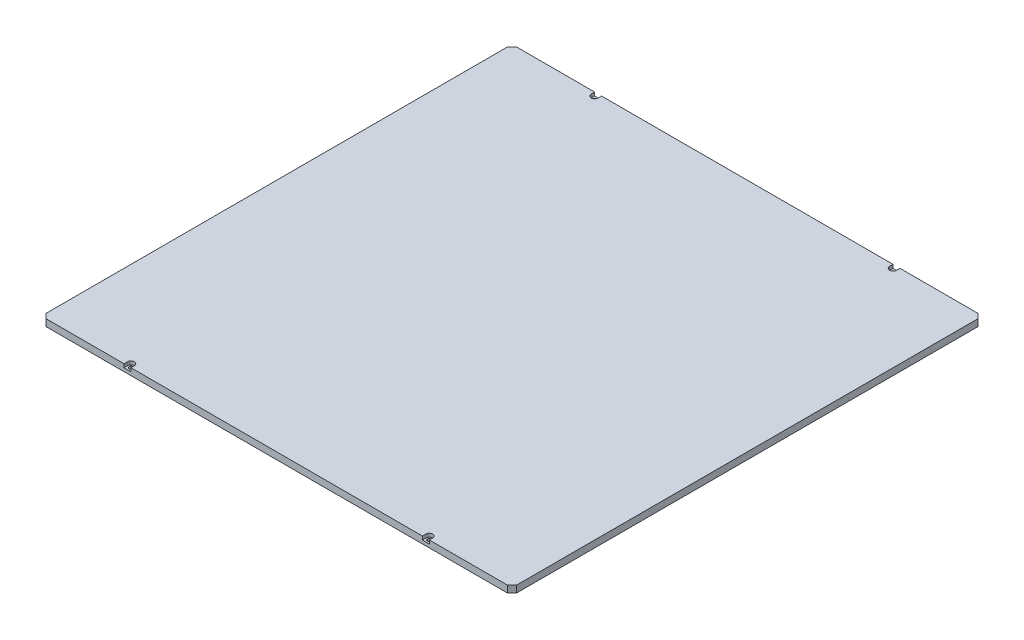
ISO-10303-21;
HEADER;
FILE_DESCRIPTION(('STEP AP214'),'2;1');
FILE_NAME('part.step','',(''),(''),'','','');
FILE_SCHEMA(('AUTOMOTIVE_DESIGN { 1 0 10303 214 1 1 1 1 }'));
ENDSEC;
DATA;
#1=APPLICATION_CONTEXT('core data for automotive mechanical design processes');
#2=APPLICATION_PROTOCOL_DEFINITION('international standard','automotive_design',2000,#1);
#3=PRODUCT_CONTEXT('',#1,'mechanical');
#4=PRODUCT('Part','Part','',(#3));
#5=PRODUCT_RELATED_PRODUCT_CATEGORY('part','',(#4));
#6=PRODUCT_DEFINITION_FORMATION('','',#4);
#7=PRODUCT_DEFINITION_CONTEXT('part definition',#1,'design');
#8=PRODUCT_DEFINITION('design','',#6,#7);
#9=PRODUCT_DEFINITION_SHAPE('','',#8);
#10=(LENGTH_UNIT() NAMED_UNIT(*) SI_UNIT(.MILLI.,.METRE.));
#11=(NAMED_UNIT(*) PLANE_ANGLE_UNIT() SI_UNIT($,.RADIAN.));
#12=(NAMED_UNIT(*) SI_UNIT($,.STERADIAN.) SOLID_ANGLE_UNIT());
#13=UNCERTAINTY_MEASURE_WITH_UNIT(LENGTH_MEASURE(1.E-05),#10,'distance_accuracy_value','');
#14=(GEOMETRIC_REPRESENTATION_CONTEXT(3) GLOBAL_UNCERTAINTY_ASSIGNED_CONTEXT((#13)) GLOBAL_UNIT_ASSIGNED_CONTEXT((#10,
#11,#12)) REPRESENTATION_CONTEXT('',''));
#15=CARTESIAN_POINT('',(0.,0.,0.));
#16=DIRECTION('',(0.,0.,1.));
#17=DIRECTION('',(1.,0.,0.));
#18=AXIS2_PLACEMENT_3D('',#15,#16,#17);
#19=CARTESIAN_POINT('',(-205.,3.,205.));
#20=DIRECTION('',(1.,0.,0.));
#21=DIRECTION('',(0.,0.,-1.));
#22=AXIS2_PLACEMENT_3D('',#19,#20,#21);
#23=PLANE('',#22);
#24=DIRECTION('',(0.,0.,1.));
#25=VECTOR('',#24,1.);
#26=CARTESIAN_POINT('',(-205.,3.,205.));
#27=LINE('',#26,#25);
#28=CARTESIAN_POINT('',(-205.,3.,-201.));
#29=VERTEX_POINT('',#28);
#30=CARTESIAN_POINT('',(-205.,3.,201.));
#31=VERTEX_POINT('',#30);
#32=EDGE_CURVE('E318',#29,#31,#27,.T.);
#33=ORIENTED_EDGE('',*,*,#32,.F.);
#34=DIRECTION('',(0.,-1.,0.));
#35=VECTOR('',#34,1.);
#36=CARTESIAN_POINT('',(-205.,3.,-201.));
#37=LINE('',#36,#35);
#38=CARTESIAN_POINT('',(-205.,-3.,-201.));
#39=VERTEX_POINT('',#38);
#40=EDGE_CURVE('E347',#29,#39,#37,.T.);
#41=ORIENTED_EDGE('',*,*,#40,.T.);
#42=DIRECTION('',(0.,0.,1.));
#43=VECTOR('',#42,1.);
#44=CARTESIAN_POINT('',(-205.,-3.,205.));
#45=LINE('',#44,#43);
#46=CARTESIAN_POINT('',(-205.,-3.,201.));
#47=VERTEX_POINT('',#46);
#48=EDGE_CURVE('E310',#39,#47,#45,.T.);
#49=ORIENTED_EDGE('',*,*,#48,.T.);
#50=DIRECTION('',(0.,1.,0.));
#51=VECTOR('',#50,1.);
#52=CARTESIAN_POINT('',(-205.,3.,201.));
#53=LINE('',#52,#51);
#54=EDGE_CURVE('E334',#47,#31,#53,.T.);
#55=ORIENTED_EDGE('',*,*,#54,.T.);
#56=EDGE_LOOP('',(#33,#41,#49,#55));
#57=FACE_BOUND('',#56,.T.);
#58=ADVANCED_FACE('F35',(#57),#23,.F.);
#59=CARTESIAN_POINT('',(205.,3.,205.));
#60=DIRECTION('',(0.,0.,-1.));
#61=DIRECTION('',(-1.,0.,0.));
#62=AXIS2_PLACEMENT_3D('',#59,#60,#61);
#63=PLANE('',#62);
#64=DIRECTION('',(1.,0.,0.));
#65=VECTOR('',#64,1.);
#66=CARTESIAN_POINT('',(205.,3.,205.));
#67=LINE('',#66,#65);
#68=CARTESIAN_POINT('',(-127.,3.,205.));
#69=VERTEX_POINT('',#68);
#70=CARTESIAN_POINT('',(127.,3.,205.));
#71=VERTEX_POINT('',#70);
#72=EDGE_CURVE('E327',#69,#71,#67,.T.);
#73=ORIENTED_EDGE('',*,*,#72,.F.);
#74=DIRECTION('',(0.,1.,0.));
#75=VECTOR('',#74,1.);
#76=CARTESIAN_POINT('',(-127.,0.,205.));
#77=LINE('',#76,#75);
#78=CARTESIAN_POINT('',(-127.,0.,205.));
#79=VERTEX_POINT('',#78);
#80=EDGE_CURVE('E255',#79,#69,#77,.T.);
#81=ORIENTED_EDGE('',*,*,#80,.F.);
#82=DIRECTION('',(1.,0.,0.));
#83=VECTOR('',#82,1.);
#84=CARTESIAN_POINT('',(-133.,0.,205.));
#85=LINE('',#84,#83);
#86=CARTESIAN_POINT('',(-133.,0.,205.));
#87=VERTEX_POINT('',#86);
#88=EDGE_CURVE('E241',#87,#79,#85,.T.);
#89=ORIENTED_EDGE('',*,*,#88,.F.);
#90=DIRECTION('',(0.,1.,0.));
#91=VECTOR('',#90,1.);
#92=CARTESIAN_POINT('',(-133.,0.,205.));
#93=LINE('',#92,#91);
#94=CARTESIAN_POINT('',(-133.,3.,205.));
#95=VERTEX_POINT('',#94);
#96=EDGE_CURVE('E257',#87,#95,#93,.T.);
#97=ORIENTED_EDGE('',*,*,#96,.T.);
#98=CARTESIAN_POINT('',(-201.,3.,205.));
#99=VERTEX_POINT('',#98);
#100=EDGE_CURVE('E323',#99,#95,#67,.T.);
#101=ORIENTED_EDGE('',*,*,#100,.F.);
#102=DIRECTION('',(0.,-1.,0.));
#103=VECTOR('',#102,1.);
#104=CARTESIAN_POINT('',(-201.,3.,205.));
#105=LINE('',#104,#103);
#106=CARTESIAN_POINT('',(-201.,-3.,205.));
#107=VERTEX_POINT('',#106);
#108=EDGE_CURVE('E43',#99,#107,#105,.T.);
#109=ORIENTED_EDGE('',*,*,#108,.T.);
#110=DIRECTION('',(1.,0.,0.));
#111=VECTOR('',#110,1.);
#112=CARTESIAN_POINT('',(205.,-3.,205.));
#113=LINE('',#112,#111);
#114=CARTESIAN_POINT('',(201.,-3.,205.));
#115=VERTEX_POINT('',#114);
#116=EDGE_CURVE('E338',#107,#115,#113,.T.);
#117=ORIENTED_EDGE('',*,*,#116,.T.);
#118=DIRECTION('',(0.,1.,0.));
#119=VECTOR('',#118,1.);
#120=CARTESIAN_POINT('',(201.,3.,205.));
#121=LINE('',#120,#119);
#122=CARTESIAN_POINT('',(201.,3.,205.));
#123=VERTEX_POINT('',#122);
#124=EDGE_CURVE('E11',#115,#123,#121,.T.);
#125=ORIENTED_EDGE('',*,*,#124,.T.);
#126=CARTESIAN_POINT('',(133.,3.,205.));
#127=VERTEX_POINT('',#126);
#128=EDGE_CURVE('E321',#127,#123,#67,.T.);
#129=ORIENTED_EDGE('',*,*,#128,.F.);
#130=DIRECTION('',(0.,1.,0.));
#131=VECTOR('',#130,1.);
#132=CARTESIAN_POINT('',(133.,0.,205.));
#133=LINE('',#132,#131);
#134=CARTESIAN_POINT('',(133.,0.,205.));
#135=VERTEX_POINT('',#134);
#136=EDGE_CURVE('E311',#135,#127,#133,.T.);
#137=ORIENTED_EDGE('',*,*,#136,.F.);
#138=DIRECTION('',(1.,0.,0.));
#139=VECTOR('',#138,1.);
#140=CARTESIAN_POINT('',(127.,0.,205.));
#141=LINE('',#140,#139);
#142=CARTESIAN_POINT('',(127.,0.,205.));
#143=VERTEX_POINT('',#142);
#144=EDGE_CURVE('E296',#143,#135,#141,.T.);
#145=ORIENTED_EDGE('',*,*,#144,.F.);
#146=DIRECTION('',(0.,1.,0.));
#147=VECTOR('',#146,1.);
#148=CARTESIAN_POINT('',(127.,0.,205.));
#149=LINE('',#148,#147);
#150=EDGE_CURVE('E313',#143,#71,#149,.T.);
#151=ORIENTED_EDGE('',*,*,#150,.T.);
#152=EDGE_LOOP('',(#73,#81,#89,#97,#101,#109,#117,#125,#129,#137,#145,#151));
#153=FACE_BOUND('',#152,.T.);
#154=ADVANCED_FACE('F382',(#153),#63,.F.);
#155=CARTESIAN_POINT('',(205.,3.,205.));
#156=DIRECTION('',(-1.,0.,0.));
#157=DIRECTION('',(0.,0.,1.));
#158=AXIS2_PLACEMENT_3D('',#155,#156,#157);
#159=PLANE('',#158);
#160=DIRECTION('',(0.,0.,-1.));
#161=VECTOR('',#160,1.);
#162=CARTESIAN_POINT('',(205.,-3.,205.));
#163=LINE('',#162,#161);
#164=CARTESIAN_POINT('',(205.,-3.,201.));
#165=VERTEX_POINT('',#164);
#166=CARTESIAN_POINT('',(205.,-3.,-201.));
#167=VERTEX_POINT('',#166);
#168=EDGE_CURVE('E341',#165,#167,#163,.T.);
#169=ORIENTED_EDGE('',*,*,#168,.T.);
#170=DIRECTION('',(0.,1.,0.));
#171=VECTOR('',#170,1.);
#172=CARTESIAN_POINT('',(205.,3.,-201.));
#173=LINE('',#172,#171);
#174=CARTESIAN_POINT('',(205.,3.,-201.));
#175=VERTEX_POINT('',#174);
#176=EDGE_CURVE('E375',#167,#175,#173,.T.);
#177=ORIENTED_EDGE('',*,*,#176,.T.);
#178=DIRECTION('',(0.,0.,-1.));
#179=VECTOR('',#178,1.);
#180=CARTESIAN_POINT('',(205.,3.,205.));
#181=LINE('',#180,#179);
#182=CARTESIAN_POINT('',(205.,3.,201.));
#183=VERTEX_POINT('',#182);
#184=EDGE_CURVE('E326',#183,#175,#181,.T.);
#185=ORIENTED_EDGE('',*,*,#184,.F.);
#186=DIRECTION('',(0.,-1.,0.));
#187=VECTOR('',#186,1.);
#188=CARTESIAN_POINT('',(205.,3.,201.));
#189=LINE('',#188,#187);
#190=EDGE_CURVE('E372',#183,#165,#189,.T.);
#191=ORIENTED_EDGE('',*,*,#190,.T.);
#192=EDGE_LOOP('',(#169,#177,#185,#191));
#193=FACE_BOUND('',#192,.T.);
#194=ADVANCED_FACE('F396',(#193),#159,.F.);
#195=CARTESIAN_POINT('',(205.,3.,-205.));
#196=DIRECTION('',(0.,0.,1.));
#197=DIRECTION('',(1.,0.,0.));
#198=AXIS2_PLACEMENT_3D('',#195,#196,#197);
#199=PLANE('',#198);
#200=DIRECTION('',(-1.,0.,0.));
#201=VECTOR('',#200,1.);
#202=CARTESIAN_POINT('',(205.,3.,-205.));
#203=LINE('',#202,#201);
#204=CARTESIAN_POINT('',(-133.,3.,-205.));
#205=VERTEX_POINT('',#204);
#206=CARTESIAN_POINT('',(-201.,3.,-205.));
#207=VERTEX_POINT('',#206);
#208=EDGE_CURVE('E330',#205,#207,#203,.T.);
#209=ORIENTED_EDGE('',*,*,#208,.F.);
#210=DIRECTION('',(0.,1.,0.));
#211=VECTOR('',#210,1.);
#212=CARTESIAN_POINT('',(-133.,0.,-205.));
#213=LINE('',#212,#211);
#214=CARTESIAN_POINT('',(-133.,0.,-205.));
#215=VERTEX_POINT('',#214);
#216=EDGE_CURVE('E231',#215,#205,#213,.T.);
#217=ORIENTED_EDGE('',*,*,#216,.F.);
#218=DIRECTION('',(-1.,0.,0.));
#219=VECTOR('',#218,1.);
#220=CARTESIAN_POINT('',(-133.,0.,-205.));
#221=LINE('',#220,#219);
#222=CARTESIAN_POINT('',(-127.,0.,-205.));
#223=VERTEX_POINT('',#222);
#224=EDGE_CURVE('E211',#223,#215,#221,.T.);
#225=ORIENTED_EDGE('',*,*,#224,.F.);
#226=DIRECTION('',(0.,1.,0.));
#227=VECTOR('',#226,1.);
#228=CARTESIAN_POINT('',(-127.,0.,-205.));
#229=LINE('',#228,#227);
#230=CARTESIAN_POINT('',(-127.,3.,-205.));
#231=VERTEX_POINT('',#230);
#232=EDGE_CURVE('E202',#223,#231,#229,.T.);
#233=ORIENTED_EDGE('',*,*,#232,.T.);
#234=CARTESIAN_POINT('',(127.,3.,-205.));
#235=VERTEX_POINT('',#234);
#236=EDGE_CURVE('E335',#235,#231,#203,.T.);
#237=ORIENTED_EDGE('',*,*,#236,.F.);
#238=DIRECTION('',(0.,1.,0.));
#239=VECTOR('',#238,1.);
#240=CARTESIAN_POINT('',(127.,0.,-205.));
#241=LINE('',#240,#239);
#242=CARTESIAN_POINT('',(127.,0.,-205.));
#243=VERTEX_POINT('',#242);
#244=EDGE_CURVE('E282',#243,#235,#241,.T.);
#245=ORIENTED_EDGE('',*,*,#244,.F.);
#246=DIRECTION('',(-1.,0.,0.));
#247=VECTOR('',#246,1.);
#248=CARTESIAN_POINT('',(127.,0.,-205.));
#249=LINE('',#248,#247);
#250=CARTESIAN_POINT('',(133.,0.,-205.));
#251=VERTEX_POINT('',#250);
#252=EDGE_CURVE('E268',#251,#243,#249,.T.);
#253=ORIENTED_EDGE('',*,*,#252,.F.);
#254=DIRECTION('',(0.,1.,0.));
#255=VECTOR('',#254,1.);
#256=CARTESIAN_POINT('',(133.,0.,-205.));
#257=LINE('',#256,#255);
#258=CARTESIAN_POINT('',(133.,3.,-205.));
#259=VERTEX_POINT('',#258);
#260=EDGE_CURVE('E284',#251,#259,#257,.T.);
#261=ORIENTED_EDGE('',*,*,#260,.T.);
#262=CARTESIAN_POINT('',(201.,3.,-205.));
#263=VERTEX_POINT('',#262);
#264=EDGE_CURVE('E331',#263,#259,#203,.T.);
#265=ORIENTED_EDGE('',*,*,#264,.F.);
#266=DIRECTION('',(0.,-1.,0.));
#267=VECTOR('',#266,1.);
#268=CARTESIAN_POINT('',(201.,3.,-205.));
#269=LINE('',#268,#267);
#270=CARTESIAN_POINT('',(201.,-3.,-205.));
#271=VERTEX_POINT('',#270);
#272=EDGE_CURVE('E358',#263,#271,#269,.T.);
#273=ORIENTED_EDGE('',*,*,#272,.T.);
#274=DIRECTION('',(-1.,0.,0.));
#275=VECTOR('',#274,1.);
#276=CARTESIAN_POINT('',(205.,-3.,-205.));
#277=LINE('',#276,#275);
#278=CARTESIAN_POINT('',(-201.,-3.,-205.));
#279=VERTEX_POINT('',#278);
#280=EDGE_CURVE('E322',#271,#279,#277,.T.);
#281=ORIENTED_EDGE('',*,*,#280,.T.);
#282=DIRECTION('',(0.,1.,0.));
#283=VECTOR('',#282,1.);
#284=CARTESIAN_POINT('',(-201.,3.,-205.));
#285=LINE('',#284,#283);
#286=EDGE_CURVE('E361',#279,#207,#285,.T.);
#287=ORIENTED_EDGE('',*,*,#286,.T.);
#288=EDGE_LOOP('',(#209,#217,#225,#233,#237,#245,#253,#261,#265,#273,#281,#287));
#289=FACE_BOUND('',#288,.T.);
#290=ADVANCED_FACE('F409',(#289),#199,.F.);
#291=CARTESIAN_POINT('',(0.,3.,0.));
#292=DIRECTION('',(0.,1.,0.));
#293=DIRECTION('',(0.,0.,1.));
#294=AXIS2_PLACEMENT_3D('',#291,#292,#293);
#295=PLANE('',#294);
#296=DIRECTION('',(0.,0.,1.));
#297=VECTOR('',#296,1.);
#298=CARTESIAN_POINT('',(-133.,3.,-202.));
#299=LINE('',#298,#297);
#300=CARTESIAN_POINT('',(-133.,3.,-202.));
#301=VERTEX_POINT('',#300);
#302=EDGE_CURVE('E215',#205,#301,#299,.T.);
#303=ORIENTED_EDGE('',*,*,#302,.F.);
#304=ORIENTED_EDGE('',*,*,#208,.T.);
#305=DIRECTION('',(0.707106781186548,0.,-0.707106781186548));
#306=VECTOR('',#305,1.);
#307=CARTESIAN_POINT('',(-203.,3.,-203.));
#308=LINE('',#307,#306);
#309=EDGE_CURVE('E370',#207,#29,#308,.F.);
#310=ORIENTED_EDGE('',*,*,#309,.T.);
#311=ORIENTED_EDGE('',*,*,#32,.T.);
#312=DIRECTION('',(-0.707106781186548,0.,-0.707106781186548));
#313=VECTOR('',#312,1.);
#314=CARTESIAN_POINT('',(-203.,3.,203.));
#315=LINE('',#314,#313);
#316=EDGE_CURVE('E364',#31,#99,#315,.F.);
#317=ORIENTED_EDGE('',*,*,#316,.T.);
#318=ORIENTED_EDGE('',*,*,#100,.T.);
#319=DIRECTION('',(0.,0.,1.));
#320=VECTOR('',#319,1.);
#321=CARTESIAN_POINT('',(-133.,3.,202.));
#322=LINE('',#321,#320);
#323=CARTESIAN_POINT('',(-133.,3.,202.));
#324=VERTEX_POINT('',#323);
#325=EDGE_CURVE('E248',#324,#95,#322,.T.);
#326=ORIENTED_EDGE('',*,*,#325,.F.);
#327=CARTESIAN_POINT('',(-130.,3.,202.));
#328=DIRECTION('',(0.,1.,0.));
#329=DIRECTION('',(0.,0.,1.));
#330=AXIS2_PLACEMENT_3D('',#327,#328,#329);
#331=CIRCLE('',#330,3.);
#332=CARTESIAN_POINT('',(-127.,3.,202.));
#333=VERTEX_POINT('',#332);
#334=EDGE_CURVE('E58',#333,#324,#331,.T.);
#335=ORIENTED_EDGE('',*,*,#334,.F.);
#336=DIRECTION('',(0.,0.,-1.));
#337=VECTOR('',#336,1.);
#338=CARTESIAN_POINT('',(-127.,3.,205.));
#339=LINE('',#338,#337);
#340=EDGE_CURVE('E238',#69,#333,#339,.T.);
#341=ORIENTED_EDGE('',*,*,#340,.F.);
#342=ORIENTED_EDGE('',*,*,#72,.T.);
#343=DIRECTION('',(0.,0.,1.));
#344=VECTOR('',#343,1.);
#345=CARTESIAN_POINT('',(127.,3.,202.));
#346=LINE('',#345,#344);
#347=CARTESIAN_POINT('',(127.,3.,202.));
#348=VERTEX_POINT('',#347);
#349=EDGE_CURVE('E303',#348,#71,#346,.T.);
#350=ORIENTED_EDGE('',*,*,#349,.F.);
#351=CARTESIAN_POINT('',(130.,3.,202.));
#352=DIRECTION('',(0.,1.,0.));
#353=DIRECTION('',(0.,0.,1.));
#354=AXIS2_PLACEMENT_3D('',#351,#352,#353);
#355=CIRCLE('',#354,3.);
#356=CARTESIAN_POINT('',(133.,3.,202.));
#357=VERTEX_POINT('',#356);
#358=EDGE_CURVE('E281',#357,#348,#355,.T.);
#359=ORIENTED_EDGE('',*,*,#358,.F.);
#360=DIRECTION('',(0.,0.,-1.));
#361=VECTOR('',#360,1.);
#362=CARTESIAN_POINT('',(133.,3.,205.));
#363=LINE('',#362,#361);
#364=EDGE_CURVE('E293',#127,#357,#363,.T.);
#365=ORIENTED_EDGE('',*,*,#364,.F.);
#366=ORIENTED_EDGE('',*,*,#128,.T.);
#367=DIRECTION('',(-0.707106781186548,0.,0.707106781186548));
#368=VECTOR('',#367,1.);
#369=CARTESIAN_POINT('',(203.,3.,203.));
#370=LINE('',#369,#368);
#371=EDGE_CURVE('E366',#123,#183,#370,.F.);
#372=ORIENTED_EDGE('',*,*,#371,.T.);
#373=ORIENTED_EDGE('',*,*,#184,.T.);
#374=DIRECTION('',(0.707106781186548,0.,0.707106781186548));
#375=VECTOR('',#374,1.);
#376=CARTESIAN_POINT('',(203.,3.,-203.));
#377=LINE('',#376,#375);
#378=EDGE_CURVE('E368',#175,#263,#377,.F.);
#379=ORIENTED_EDGE('',*,*,#378,.T.);
#380=ORIENTED_EDGE('',*,*,#264,.T.);
#381=DIRECTION('',(0.,0.,-1.));
#382=VECTOR('',#381,1.);
#383=CARTESIAN_POINT('',(133.,3.,-205.));
#384=LINE('',#383,#382);
#385=CARTESIAN_POINT('',(133.,3.,-202.));
#386=VERTEX_POINT('',#385);
#387=EDGE_CURVE('E275',#386,#259,#384,.T.);
#388=ORIENTED_EDGE('',*,*,#387,.F.);
#389=CARTESIAN_POINT('',(130.,3.,-202.));
#390=DIRECTION('',(0.,1.,0.));
#391=DIRECTION('',(0.,0.,1.));
#392=AXIS2_PLACEMENT_3D('',#389,#390,#391);
#393=CIRCLE('',#392,3.);
#394=CARTESIAN_POINT('',(127.,3.,-202.));
#395=VERTEX_POINT('',#394);
#396=EDGE_CURVE('E254',#395,#386,#393,.T.);
#397=ORIENTED_EDGE('',*,*,#396,.F.);
#398=DIRECTION('',(0.,0.,1.));
#399=VECTOR('',#398,1.);
#400=CARTESIAN_POINT('',(127.,3.,-202.));
#401=LINE('',#400,#399);
#402=EDGE_CURVE('E265',#235,#395,#401,.T.);
#403=ORIENTED_EDGE('',*,*,#402,.F.);
#404=ORIENTED_EDGE('',*,*,#236,.T.);
#405=DIRECTION('',(0.,0.,-1.));
#406=VECTOR('',#405,1.);
#407=CARTESIAN_POINT('',(-127.,3.,-205.));
#408=LINE('',#407,#406);
#409=CARTESIAN_POINT('',(-127.,3.,-202.));
#410=VERTEX_POINT('',#409);
#411=EDGE_CURVE('E218',#410,#231,#408,.T.);
#412=ORIENTED_EDGE('',*,*,#411,.F.);
#413=CARTESIAN_POINT('',(-130.,3.,-202.));
#414=DIRECTION('',(0.,1.,0.));
#415=DIRECTION('',(0.,0.,1.));
#416=AXIS2_PLACEMENT_3D('',#413,#414,#415);
#417=CIRCLE('',#416,3.);
#418=EDGE_CURVE('E50',#301,#410,#417,.T.);
#419=ORIENTED_EDGE('',*,*,#418,.F.);
#420=EDGE_LOOP('',(#303,#304,#310,#311,#317,#318,#326,#335,#341,#342,#350,#359,#365,#366,#372,
#373,#379,#380,#388,#397,#403,#404,#412,#419));
#421=FACE_BOUND('',#420,.T.);
#422=ADVANCED_FACE('F401',(#421),#295,.T.);
#423=CARTESIAN_POINT('',(0.,-3.,0.));
#424=DIRECTION('',(0.,1.,0.));
#425=DIRECTION('',(0.,0.,1.));
#426=AXIS2_PLACEMENT_3D('',#423,#424,#425);
#427=PLANE('',#426);
#428=CARTESIAN_POINT('',(-130.,-3.,-202.));
#429=DIRECTION('',(0.,1.,0.));
#430=DIRECTION('',(0.,0.,1.));
#431=AXIS2_PLACEMENT_3D('',#428,#429,#430);
#432=CIRCLE('',#431,1.65000000000002);
#433=CARTESIAN_POINT('',(-130.,-3.,-200.35));
#434=VERTEX_POINT('',#433);
#435=EDGE_CURVE('E694',#434,#434,#432,.T.);
#436=ORIENTED_EDGE('',*,*,#435,.T.);
#437=EDGE_LOOP('',(#436));
#438=FACE_BOUND('',#437,.T.);
#439=CARTESIAN_POINT('',(130.,-3.,-202.));
#440=DIRECTION('',(0.,1.,0.));
#441=DIRECTION('',(0.,0.,1.));
#442=AXIS2_PLACEMENT_3D('',#439,#440,#441);
#443=CIRCLE('',#442,1.65000000000002);
#444=CARTESIAN_POINT('',(130.,-3.,-200.35));
#445=VERTEX_POINT('',#444);
#446=EDGE_CURVE('E702',#445,#445,#443,.T.);
#447=ORIENTED_EDGE('',*,*,#446,.T.);
#448=EDGE_LOOP('',(#447));
#449=FACE_BOUND('',#448,.T.);
#450=CARTESIAN_POINT('',(130.,-3.,202.));
#451=DIRECTION('',(0.,1.,0.));
#452=DIRECTION('',(0.,0.,1.));
#453=AXIS2_PLACEMENT_3D('',#450,#451,#452);
#454=CIRCLE('',#453,1.65000000000002);
#455=CARTESIAN_POINT('',(130.,-3.,203.65));
#456=VERTEX_POINT('',#455);
#457=EDGE_CURVE('E708',#456,#456,#454,.T.);
#458=ORIENTED_EDGE('',*,*,#457,.T.);
#459=EDGE_LOOP('',(#458));
#460=FACE_BOUND('',#459,.T.);
#461=CARTESIAN_POINT('',(-130.,-3.,202.));
#462=DIRECTION('',(0.,1.,0.));
#463=DIRECTION('',(0.,0.,1.));
#464=AXIS2_PLACEMENT_3D('',#461,#462,#463);
#465=CIRCLE('',#464,1.65000000000002);
#466=CARTESIAN_POINT('',(-130.,-3.,203.65));
#467=VERTEX_POINT('',#466);
#468=EDGE_CURVE('E227',#467,#467,#465,.T.);
#469=ORIENTED_EDGE('',*,*,#468,.T.);
#470=EDGE_LOOP('',(#469));
#471=FACE_BOUND('',#470,.T.);
#472=ORIENTED_EDGE('',*,*,#48,.F.);
#473=DIRECTION('',(-0.707106781186548,0.,0.707106781186548));
#474=VECTOR('',#473,1.);
#475=CARTESIAN_POINT('',(-205.,-3.,-201.));
#476=LINE('',#475,#474);
#477=EDGE_CURVE('E356',#39,#279,#476,.F.);
#478=ORIENTED_EDGE('',*,*,#477,.T.);
#479=ORIENTED_EDGE('',*,*,#280,.F.);
#480=DIRECTION('',(-0.707106781186548,0.,-0.707106781186548));
#481=VECTOR('',#480,1.);
#482=CARTESIAN_POINT('',(201.,-3.,-205.));
#483=LINE('',#482,#481);
#484=EDGE_CURVE('E354',#271,#167,#483,.F.);
#485=ORIENTED_EDGE('',*,*,#484,.T.);
#486=ORIENTED_EDGE('',*,*,#168,.F.);
#487=DIRECTION('',(0.707106781186548,0.,-0.707106781186548));
#488=VECTOR('',#487,1.);
#489=CARTESIAN_POINT('',(205.,-3.,201.));
#490=LINE('',#489,#488);
#491=EDGE_CURVE('E352',#165,#115,#490,.F.);
#492=ORIENTED_EDGE('',*,*,#491,.T.);
#493=ORIENTED_EDGE('',*,*,#116,.F.);
#494=DIRECTION('',(0.707106781186548,0.,0.707106781186548));
#495=VECTOR('',#494,1.);
#496=CARTESIAN_POINT('',(-201.,-3.,205.));
#497=LINE('',#496,#495);
#498=EDGE_CURVE('E350',#107,#47,#497,.F.);
#499=ORIENTED_EDGE('',*,*,#498,.T.);
#500=EDGE_LOOP('',(#472,#478,#479,#485,#486,#492,#493,#499));
#501=FACE_BOUND('',#500,.T.);
#502=ADVANCED_FACE('F388',(#438,#449,#460,#471,#501),#427,.F.);
#503=CARTESIAN_POINT('',(-205.,3.,-201.));
#504=DIRECTION('',(0.707106781186547,0.,0.707106781186547));
#505=DIRECTION('',(0.,-1.,0.));
#506=AXIS2_PLACEMENT_3D('',#503,#504,#505);
#507=PLANE('',#506);
#508=ORIENTED_EDGE('',*,*,#309,.F.);
#509=ORIENTED_EDGE('',*,*,#286,.F.);
#510=ORIENTED_EDGE('',*,*,#477,.F.);
#511=ORIENTED_EDGE('',*,*,#40,.F.);
#512=EDGE_LOOP('',(#508,#509,#510,#511));
#513=FACE_BOUND('',#512,.T.);
#514=ADVANCED_FACE('F414',(#513),#507,.F.);
#515=CARTESIAN_POINT('',(201.,3.,-205.));
#516=DIRECTION('',(-0.707106781186547,0.,0.707106781186547));
#517=DIRECTION('',(0.,-1.,0.));
#518=AXIS2_PLACEMENT_3D('',#515,#516,#517);
#519=PLANE('',#518);
#520=ORIENTED_EDGE('',*,*,#378,.F.);
#521=ORIENTED_EDGE('',*,*,#176,.F.);
#522=ORIENTED_EDGE('',*,*,#484,.F.);
#523=ORIENTED_EDGE('',*,*,#272,.F.);
#524=EDGE_LOOP('',(#520,#521,#522,#523));
#525=FACE_BOUND('',#524,.T.);
#526=ADVANCED_FACE('F405',(#525),#519,.F.);
#527=CARTESIAN_POINT('',(205.,3.,201.));
#528=DIRECTION('',(-0.707106781186547,0.,-0.707106781186547));
#529=DIRECTION('',(0.,-1.,0.));
#530=AXIS2_PLACEMENT_3D('',#527,#528,#529);
#531=PLANE('',#530);
#532=ORIENTED_EDGE('',*,*,#371,.F.);
#533=ORIENTED_EDGE('',*,*,#124,.F.);
#534=ORIENTED_EDGE('',*,*,#491,.F.);
#535=ORIENTED_EDGE('',*,*,#190,.F.);
#536=EDGE_LOOP('',(#532,#533,#534,#535));
#537=FACE_BOUND('',#536,.T.);
#538=ADVANCED_FACE('F393',(#537),#531,.F.);
#539=CARTESIAN_POINT('',(-201.,3.,205.));
#540=DIRECTION('',(0.707106781186547,0.,-0.707106781186547));
#541=DIRECTION('',(0.,-1.,0.));
#542=AXIS2_PLACEMENT_3D('',#539,#540,#541);
#543=PLANE('',#542);
#544=ORIENTED_EDGE('',*,*,#316,.F.);
#545=ORIENTED_EDGE('',*,*,#54,.F.);
#546=ORIENTED_EDGE('',*,*,#498,.F.);
#547=ORIENTED_EDGE('',*,*,#108,.F.);
#548=EDGE_LOOP('',(#544,#545,#546,#547));
#549=FACE_BOUND('',#548,.T.);
#550=ADVANCED_FACE('F37',(#549),#543,.F.);
#551=CARTESIAN_POINT('',(130.,0.,202.));
#552=DIRECTION('',(0.,1.,0.));
#553=DIRECTION('',(0.,0.,1.));
#554=AXIS2_PLACEMENT_3D('',#551,#552,#553);
#555=CYLINDRICAL_SURFACE('',#554,3.);
#556=ORIENTED_EDGE('',*,*,#358,.T.);
#557=DIRECTION('',(0.,1.,0.));
#558=VECTOR('',#557,1.);
#559=CARTESIAN_POINT('',(127.,0.,202.));
#560=LINE('',#559,#558);
#561=CARTESIAN_POINT('',(127.,0.,202.));
#562=VERTEX_POINT('',#561);
#563=EDGE_CURVE('E301',#562,#348,#560,.T.);
#564=ORIENTED_EDGE('',*,*,#563,.F.);
#565=CARTESIAN_POINT('',(130.,0.,202.));
#566=DIRECTION('',(0.,1.,0.));
#567=DIRECTION('',(0.,0.,1.));
#568=AXIS2_PLACEMENT_3D('',#565,#566,#567);
#569=CIRCLE('',#568,3.);
#570=CARTESIAN_POINT('',(133.,0.,202.));
#571=VERTEX_POINT('',#570);
#572=EDGE_CURVE('E289',#571,#562,#569,.T.);
#573=ORIENTED_EDGE('',*,*,#572,.F.);
#574=DIRECTION('',(0.,1.,0.));
#575=VECTOR('',#574,1.);
#576=CARTESIAN_POINT('',(133.,0.,202.));
#577=LINE('',#576,#575);
#578=EDGE_CURVE('E308',#571,#357,#577,.T.);
#579=ORIENTED_EDGE('',*,*,#578,.T.);
#580=EDGE_LOOP('',(#556,#564,#573,#579));
#581=FACE_BOUND('',#580,.T.);
#582=ADVANCED_FACE('F419',(#581),#555,.F.);
#583=CARTESIAN_POINT('',(133.,0.,205.));
#584=DIRECTION('',(1.,0.,0.));
#585=DIRECTION('',(0.,0.,-1.));
#586=AXIS2_PLACEMENT_3D('',#583,#584,#585);
#587=PLANE('',#586);
#588=ORIENTED_EDGE('',*,*,#364,.T.);
#589=ORIENTED_EDGE('',*,*,#578,.F.);
#590=DIRECTION('',(0.,0.,-1.));
#591=VECTOR('',#590,1.);
#592=CARTESIAN_POINT('',(133.,0.,205.));
#593=LINE('',#592,#591);
#594=EDGE_CURVE('E298',#135,#571,#593,.T.);
#595=ORIENTED_EDGE('',*,*,#594,.F.);
#596=ORIENTED_EDGE('',*,*,#136,.T.);
#597=EDGE_LOOP('',(#588,#589,#595,#596));
#598=FACE_BOUND('',#597,.T.);
#599=ADVANCED_FACE('F424',(#598),#587,.F.);
#600=CARTESIAN_POINT('',(127.,0.,202.));
#601=DIRECTION('',(-1.,0.,0.));
#602=DIRECTION('',(0.,0.,1.));
#603=AXIS2_PLACEMENT_3D('',#600,#601,#602);
#604=PLANE('',#603);
#605=ORIENTED_EDGE('',*,*,#349,.T.);
#606=ORIENTED_EDGE('',*,*,#150,.F.);
#607=DIRECTION('',(0.,0.,1.));
#608=VECTOR('',#607,1.);
#609=CARTESIAN_POINT('',(127.,0.,202.));
#610=LINE('',#609,#608);
#611=EDGE_CURVE('E292',#562,#143,#610,.T.);
#612=ORIENTED_EDGE('',*,*,#611,.F.);
#613=ORIENTED_EDGE('',*,*,#563,.T.);
#614=EDGE_LOOP('',(#605,#606,#612,#613));
#615=FACE_BOUND('',#614,.T.);
#616=ADVANCED_FACE('F492',(#615),#604,.F.);
#617=CARTESIAN_POINT('',(130.,0.,202.));
#618=DIRECTION('',(0.,1.,0.));
#619=DIRECTION('',(0.,0.,1.));
#620=AXIS2_PLACEMENT_3D('',#617,#618,#619);
#621=PLANE('',#620);
#622=CARTESIAN_POINT('',(130.,0.,202.));
#623=DIRECTION('',(0.,1.,0.));
#624=DIRECTION('',(0.,0.,1.));
#625=AXIS2_PLACEMENT_3D('',#622,#623,#624);
#626=CIRCLE('',#625,1.65000000000002);
#627=CARTESIAN_POINT('',(130.,0.,203.65));
#628=VERTEX_POINT('',#627);
#629=EDGE_CURVE('E705',#628,#628,#626,.T.);
#630=ORIENTED_EDGE('',*,*,#629,.F.);
#631=EDGE_LOOP('',(#630));
#632=FACE_BOUND('',#631,.T.);
#633=ORIENTED_EDGE('',*,*,#572,.T.);
#634=ORIENTED_EDGE('',*,*,#611,.T.);
#635=ORIENTED_EDGE('',*,*,#144,.T.);
#636=ORIENTED_EDGE('',*,*,#594,.T.);
#637=EDGE_LOOP('',(#633,#634,#635,#636));
#638=FACE_BOUND('',#637,.T.);
#639=ADVANCED_FACE('F502',(#632,#638),#621,.T.);
#640=CARTESIAN_POINT('',(130.,0.,-202.));
#641=DIRECTION('',(0.,1.,0.));
#642=DIRECTION('',(0.,0.,1.));
#643=AXIS2_PLACEMENT_3D('',#640,#641,#642);
#644=CYLINDRICAL_SURFACE('',#643,3.);
#645=ORIENTED_EDGE('',*,*,#396,.T.);
#646=DIRECTION('',(0.,1.,0.));
#647=VECTOR('',#646,1.);
#648=CARTESIAN_POINT('',(133.,0.,-202.));
#649=LINE('',#648,#647);
#650=CARTESIAN_POINT('',(133.,0.,-202.));
#651=VERTEX_POINT('',#650);
#652=EDGE_CURVE('E273',#651,#386,#649,.T.);
#653=ORIENTED_EDGE('',*,*,#652,.F.);
#654=CARTESIAN_POINT('',(130.,0.,-202.));
#655=DIRECTION('',(0.,1.,0.));
#656=DIRECTION('',(0.,0.,1.));
#657=AXIS2_PLACEMENT_3D('',#654,#655,#656);
#658=CIRCLE('',#657,3.);
#659=CARTESIAN_POINT('',(127.,0.,-202.));
#660=VERTEX_POINT('',#659);
#661=EDGE_CURVE('E261',#660,#651,#658,.T.);
#662=ORIENTED_EDGE('',*,*,#661,.F.);
#663=DIRECTION('',(0.,1.,0.));
#664=VECTOR('',#663,1.);
#665=CARTESIAN_POINT('',(127.,0.,-202.));
#666=LINE('',#665,#664);
#667=EDGE_CURVE('E279',#660,#395,#666,.T.);
#668=ORIENTED_EDGE('',*,*,#667,.T.);
#669=EDGE_LOOP('',(#645,#653,#662,#668));
#670=FACE_BOUND('',#669,.T.);
#671=ADVANCED_FACE('F510',(#670),#644,.F.);
#672=CARTESIAN_POINT('',(127.,0.,-202.));
#673=DIRECTION('',(-1.,0.,0.));
#674=DIRECTION('',(0.,0.,1.));
#675=AXIS2_PLACEMENT_3D('',#672,#673,#674);
#676=PLANE('',#675);
#677=ORIENTED_EDGE('',*,*,#402,.T.);
#678=ORIENTED_EDGE('',*,*,#667,.F.);
#679=DIRECTION('',(0.,0.,1.));
#680=VECTOR('',#679,1.);
#681=CARTESIAN_POINT('',(127.,0.,-202.));
#682=LINE('',#681,#680);
#683=EDGE_CURVE('E270',#243,#660,#682,.T.);
#684=ORIENTED_EDGE('',*,*,#683,.F.);
#685=ORIENTED_EDGE('',*,*,#244,.T.);
#686=EDGE_LOOP('',(#677,#678,#684,#685));
#687=FACE_BOUND('',#686,.T.);
#688=ADVANCED_FACE('F515',(#687),#676,.F.);
#689=CARTESIAN_POINT('',(133.,0.,-205.));
#690=DIRECTION('',(1.,0.,0.));
#691=DIRECTION('',(0.,0.,-1.));
#692=AXIS2_PLACEMENT_3D('',#689,#690,#691);
#693=PLANE('',#692);
#694=ORIENTED_EDGE('',*,*,#387,.T.);
#695=ORIENTED_EDGE('',*,*,#260,.F.);
#696=DIRECTION('',(0.,0.,-1.));
#697=VECTOR('',#696,1.);
#698=CARTESIAN_POINT('',(133.,0.,-205.));
#699=LINE('',#698,#697);
#700=EDGE_CURVE('E264',#651,#251,#699,.T.);
#701=ORIENTED_EDGE('',*,*,#700,.F.);
#702=ORIENTED_EDGE('',*,*,#652,.T.);
#703=EDGE_LOOP('',(#694,#695,#701,#702));
#704=FACE_BOUND('',#703,.T.);
#705=ADVANCED_FACE('F525',(#704),#693,.F.);
#706=CARTESIAN_POINT('',(130.,0.,-202.));
#707=DIRECTION('',(0.,1.,0.));
#708=DIRECTION('',(0.,0.,1.));
#709=AXIS2_PLACEMENT_3D('',#706,#707,#708);
#710=PLANE('',#709);
#711=CARTESIAN_POINT('',(130.,0.,-202.));
#712=DIRECTION('',(0.,1.,0.));
#713=DIRECTION('',(0.,0.,1.));
#714=AXIS2_PLACEMENT_3D('',#711,#712,#713);
#715=CIRCLE('',#714,1.65000000000002);
#716=CARTESIAN_POINT('',(130.,0.,-200.35));
#717=VERTEX_POINT('',#716);
#718=EDGE_CURVE('E699',#717,#717,#715,.T.);
#719=ORIENTED_EDGE('',*,*,#718,.F.);
#720=EDGE_LOOP('',(#719));
#721=FACE_BOUND('',#720,.T.);
#722=ORIENTED_EDGE('',*,*,#661,.T.);
#723=ORIENTED_EDGE('',*,*,#700,.T.);
#724=ORIENTED_EDGE('',*,*,#252,.T.);
#725=ORIENTED_EDGE('',*,*,#683,.T.);
#726=EDGE_LOOP('',(#722,#723,#724,#725));
#727=FACE_BOUND('',#726,.T.);
#728=ADVANCED_FACE('F535',(#721,#727),#710,.T.);
#729=CARTESIAN_POINT('',(-130.,0.,202.));
#730=DIRECTION('',(0.,1.,0.));
#731=DIRECTION('',(0.,0.,1.));
#732=AXIS2_PLACEMENT_3D('',#729,#730,#731);
#733=CYLINDRICAL_SURFACE('',#732,3.);
#734=ORIENTED_EDGE('',*,*,#334,.T.);
#735=DIRECTION('',(0.,1.,0.));
#736=VECTOR('',#735,1.);
#737=CARTESIAN_POINT('',(-133.,0.,202.));
#738=LINE('',#737,#736);
#739=CARTESIAN_POINT('',(-133.,0.,202.));
#740=VERTEX_POINT('',#739);
#741=EDGE_CURVE('E246',#740,#324,#738,.T.);
#742=ORIENTED_EDGE('',*,*,#741,.F.);
#743=CARTESIAN_POINT('',(-130.,0.,202.));
#744=DIRECTION('',(0.,1.,0.));
#745=DIRECTION('',(0.,0.,1.));
#746=AXIS2_PLACEMENT_3D('',#743,#744,#745);
#747=CIRCLE('',#746,3.);
#748=CARTESIAN_POINT('',(-127.,0.,202.));
#749=VERTEX_POINT('',#748);
#750=EDGE_CURVE('E234',#749,#740,#747,.T.);
#751=ORIENTED_EDGE('',*,*,#750,.F.);
#752=DIRECTION('',(0.,1.,0.));
#753=VECTOR('',#752,1.);
#754=CARTESIAN_POINT('',(-127.,0.,202.));
#755=LINE('',#754,#753);
#756=EDGE_CURVE('E252',#749,#333,#755,.T.);
#757=ORIENTED_EDGE('',*,*,#756,.T.);
#758=EDGE_LOOP('',(#734,#742,#751,#757));
#759=FACE_BOUND('',#758,.T.);
#760=ADVANCED_FACE('F543',(#759),#733,.F.);
#761=CARTESIAN_POINT('',(-127.,0.,205.));
#762=DIRECTION('',(1.,0.,0.));
#763=DIRECTION('',(0.,0.,-1.));
#764=AXIS2_PLACEMENT_3D('',#761,#762,#763);
#765=PLANE('',#764);
#766=ORIENTED_EDGE('',*,*,#340,.T.);
#767=ORIENTED_EDGE('',*,*,#756,.F.);
#768=DIRECTION('',(0.,0.,-1.));
#769=VECTOR('',#768,1.);
#770=CARTESIAN_POINT('',(-127.,0.,205.));
#771=LINE('',#770,#769);
#772=EDGE_CURVE('E243',#79,#749,#771,.T.);
#773=ORIENTED_EDGE('',*,*,#772,.F.);
#774=ORIENTED_EDGE('',*,*,#80,.T.);
#775=EDGE_LOOP('',(#766,#767,#773,#774));
#776=FACE_BOUND('',#775,.T.);
#777=ADVANCED_FACE('F548',(#776),#765,.F.);
#778=CARTESIAN_POINT('',(-133.,0.,202.));
#779=DIRECTION('',(-1.,0.,0.));
#780=DIRECTION('',(0.,0.,1.));
#781=AXIS2_PLACEMENT_3D('',#778,#779,#780);
#782=PLANE('',#781);
#783=ORIENTED_EDGE('',*,*,#325,.T.);
#784=ORIENTED_EDGE('',*,*,#96,.F.);
#785=DIRECTION('',(0.,0.,1.));
#786=VECTOR('',#785,1.);
#787=CARTESIAN_POINT('',(-133.,0.,202.));
#788=LINE('',#787,#786);
#789=EDGE_CURVE('E237',#740,#87,#788,.T.);
#790=ORIENTED_EDGE('',*,*,#789,.F.);
#791=ORIENTED_EDGE('',*,*,#741,.T.);
#792=EDGE_LOOP('',(#783,#784,#790,#791));
#793=FACE_BOUND('',#792,.T.);
#794=ADVANCED_FACE('F557',(#793),#782,.F.);
#795=CARTESIAN_POINT('',(-130.,0.,202.));
#796=DIRECTION('',(0.,1.,0.));
#797=DIRECTION('',(0.,0.,1.));
#798=AXIS2_PLACEMENT_3D('',#795,#796,#797);
#799=PLANE('',#798);
#800=CARTESIAN_POINT('',(-130.,0.,202.));
#801=DIRECTION('',(0.,1.,0.));
#802=DIRECTION('',(0.,0.,1.));
#803=AXIS2_PLACEMENT_3D('',#800,#801,#802);
#804=CIRCLE('',#803,1.65000000000002);
#805=CARTESIAN_POINT('',(-130.,0.,203.65));
#806=VERTEX_POINT('',#805);
#807=EDGE_CURVE('E221',#806,#806,#804,.T.);
#808=ORIENTED_EDGE('',*,*,#807,.F.);
#809=EDGE_LOOP('',(#808));
#810=FACE_BOUND('',#809,.T.);
#811=ORIENTED_EDGE('',*,*,#750,.T.);
#812=ORIENTED_EDGE('',*,*,#789,.T.);
#813=ORIENTED_EDGE('',*,*,#88,.T.);
#814=ORIENTED_EDGE('',*,*,#772,.T.);
#815=EDGE_LOOP('',(#811,#812,#813,#814));
#816=FACE_BOUND('',#815,.T.);
#817=ADVANCED_FACE('F567',(#810,#816),#799,.T.);
#818=CARTESIAN_POINT('',(-130.,0.,-202.));
#819=DIRECTION('',(0.,1.,0.));
#820=DIRECTION('',(0.,0.,1.));
#821=AXIS2_PLACEMENT_3D('',#818,#819,#820);
#822=CYLINDRICAL_SURFACE('',#821,3.);
#823=ORIENTED_EDGE('',*,*,#418,.T.);
#824=DIRECTION('',(0.,1.,0.));
#825=VECTOR('',#824,1.);
#826=CARTESIAN_POINT('',(-127.,0.,-202.));
#827=LINE('',#826,#825);
#828=CARTESIAN_POINT('',(-127.,0.,-202.));
#829=VERTEX_POINT('',#828);
#830=EDGE_CURVE('E194',#829,#410,#827,.T.);
#831=ORIENTED_EDGE('',*,*,#830,.F.);
#832=CARTESIAN_POINT('',(-130.,0.,-202.));
#833=DIRECTION('',(0.,1.,0.));
#834=DIRECTION('',(0.,0.,1.));
#835=AXIS2_PLACEMENT_3D('',#832,#833,#834);
#836=CIRCLE('',#835,3.);
#837=CARTESIAN_POINT('',(-133.,0.,-202.));
#838=VERTEX_POINT('',#837);
#839=EDGE_CURVE('E198',#838,#829,#836,.T.);
#840=ORIENTED_EDGE('',*,*,#839,.F.);
#841=DIRECTION('',(0.,1.,0.));
#842=VECTOR('',#841,1.);
#843=CARTESIAN_POINT('',(-133.,0.,-202.));
#844=LINE('',#843,#842);
#845=EDGE_CURVE('E229',#838,#301,#844,.T.);
#846=ORIENTED_EDGE('',*,*,#845,.T.);
#847=EDGE_LOOP('',(#823,#831,#840,#846));
#848=FACE_BOUND('',#847,.T.);
#849=ADVANCED_FACE('F196',(#848),#822,.F.);
#850=CARTESIAN_POINT('',(-133.,0.,-202.));
#851=DIRECTION('',(-1.,0.,0.));
#852=DIRECTION('',(0.,0.,1.));
#853=AXIS2_PLACEMENT_3D('',#850,#851,#852);
#854=PLANE('',#853);
#855=ORIENTED_EDGE('',*,*,#302,.T.);
#856=ORIENTED_EDGE('',*,*,#845,.F.);
#857=DIRECTION('',(0.,0.,1.));
#858=VECTOR('',#857,1.);
#859=CARTESIAN_POINT('',(-133.,0.,-202.));
#860=LINE('',#859,#858);
#861=EDGE_CURVE('E203',#215,#838,#860,.T.);
#862=ORIENTED_EDGE('',*,*,#861,.F.);
#863=ORIENTED_EDGE('',*,*,#216,.T.);
#864=EDGE_LOOP('',(#855,#856,#862,#863));
#865=FACE_BOUND('',#864,.T.);
#866=ADVANCED_FACE('F579',(#865),#854,.F.);
#867=CARTESIAN_POINT('',(-127.,0.,-205.));
#868=DIRECTION('',(1.,0.,0.));
#869=DIRECTION('',(0.,0.,-1.));
#870=AXIS2_PLACEMENT_3D('',#867,#868,#869);
#871=PLANE('',#870);
#872=ORIENTED_EDGE('',*,*,#411,.T.);
#873=ORIENTED_EDGE('',*,*,#232,.F.);
#874=DIRECTION('',(0.,0.,-1.));
#875=VECTOR('',#874,1.);
#876=CARTESIAN_POINT('',(-127.,0.,-205.));
#877=LINE('',#876,#875);
#878=EDGE_CURVE('E206',#829,#223,#877,.T.);
#879=ORIENTED_EDGE('',*,*,#878,.F.);
#880=ORIENTED_EDGE('',*,*,#830,.T.);
#881=EDGE_LOOP('',(#872,#873,#879,#880));
#882=FACE_BOUND('',#881,.T.);
#883=ADVANCED_FACE('F207',(#882),#871,.F.);
#884=CARTESIAN_POINT('',(-130.,0.,-202.));
#885=DIRECTION('',(0.,1.,0.));
#886=DIRECTION('',(0.,0.,1.));
#887=AXIS2_PLACEMENT_3D('',#884,#885,#886);
#888=PLANE('',#887);
#889=CARTESIAN_POINT('',(-130.,0.,-202.));
#890=DIRECTION('',(0.,1.,0.));
#891=DIRECTION('',(0.,0.,1.));
#892=AXIS2_PLACEMENT_3D('',#889,#890,#891);
#893=CIRCLE('',#892,1.65000000000002);
#894=CARTESIAN_POINT('',(-130.,0.,-200.35));
#895=VERTEX_POINT('',#894);
#896=EDGE_CURVE('E697',#895,#895,#893,.T.);
#897=ORIENTED_EDGE('',*,*,#896,.F.);
#898=EDGE_LOOP('',(#897));
#899=FACE_BOUND('',#898,.T.);
#900=ORIENTED_EDGE('',*,*,#839,.T.);
#901=ORIENTED_EDGE('',*,*,#878,.T.);
#902=ORIENTED_EDGE('',*,*,#224,.T.);
#903=ORIENTED_EDGE('',*,*,#861,.T.);
#904=EDGE_LOOP('',(#900,#901,#902,#903));
#905=FACE_BOUND('',#904,.T.);
#906=ADVANCED_FACE('F213',(#899,#905),#888,.T.);
#907=CARTESIAN_POINT('',(-130.,-3.,202.));
#908=DIRECTION('',(0.,1.,0.));
#909=DIRECTION('',(0.,0.,1.));
#910=AXIS2_PLACEMENT_3D('',#907,#908,#909);
#911=CYLINDRICAL_SURFACE('',#910,1.65000000000002);
#912=ORIENTED_EDGE('',*,*,#468,.F.);
#913=EDGE_LOOP('',(#912));
#914=FACE_BOUND('',#913,.T.);
#915=ORIENTED_EDGE('',*,*,#807,.T.);
#916=EDGE_LOOP('',(#915));
#917=FACE_BOUND('',#916,.T.);
#918=ADVANCED_FACE('F634',(#914,#917),#911,.F.);
#919=CARTESIAN_POINT('',(130.,-3.,202.));
#920=DIRECTION('',(0.,1.,0.));
#921=DIRECTION('',(0.,0.,1.));
#922=AXIS2_PLACEMENT_3D('',#919,#920,#921);
#923=CYLINDRICAL_SURFACE('',#922,1.65000000000002);
#924=ORIENTED_EDGE('',*,*,#457,.F.);
#925=EDGE_LOOP('',(#924));
#926=FACE_BOUND('',#925,.T.);
#927=ORIENTED_EDGE('',*,*,#629,.T.);
#928=EDGE_LOOP('',(#927));
#929=FACE_BOUND('',#928,.T.);
#930=ADVANCED_FACE('F644',(#926,#929),#923,.F.);
#931=CARTESIAN_POINT('',(130.,-3.,-202.));
#932=DIRECTION('',(0.,1.,0.));
#933=DIRECTION('',(0.,0.,1.));
#934=AXIS2_PLACEMENT_3D('',#931,#932,#933);
#935=CYLINDRICAL_SURFACE('',#934,1.65000000000002);
#936=ORIENTED_EDGE('',*,*,#446,.F.);
#937=EDGE_LOOP('',(#936));
#938=FACE_BOUND('',#937,.T.);
#939=ORIENTED_EDGE('',*,*,#718,.T.);
#940=EDGE_LOOP('',(#939));
#941=FACE_BOUND('',#940,.T.);
#942=ADVANCED_FACE('F654',(#938,#941),#935,.F.);
#943=CARTESIAN_POINT('',(-130.,-3.,-202.));
#944=DIRECTION('',(0.,1.,0.));
#945=DIRECTION('',(0.,0.,1.));
#946=AXIS2_PLACEMENT_3D('',#943,#944,#945);
#947=CYLINDRICAL_SURFACE('',#946,1.65000000000002);
#948=ORIENTED_EDGE('',*,*,#435,.F.);
#949=EDGE_LOOP('',(#948));
#950=FACE_BOUND('',#949,.T.);
#951=ORIENTED_EDGE('',*,*,#896,.T.);
#952=EDGE_LOOP('',(#951));
#953=FACE_BOUND('',#952,.T.);
#954=ADVANCED_FACE('F664',(#950,#953),#947,.F.);
#955=CLOSED_SHELL('',(#58,#154,#194,#290,#422,#502,#514,#526,#538,#550,#582,#599,#616,#639,#671,
#688,#705,#728,#760,#777,#794,#817,#849,#866,#883,#906,#918,#930,#942,#954));
#956=MANIFOLD_SOLID_BREP('B2',#955);
#957=ADVANCED_BREP_SHAPE_REPRESENTATION('',(#18,#956),#14);
#958=SHAPE_DEFINITION_REPRESENTATION(#9,#957);
ENDSEC;
END-ISO-10303-21;
